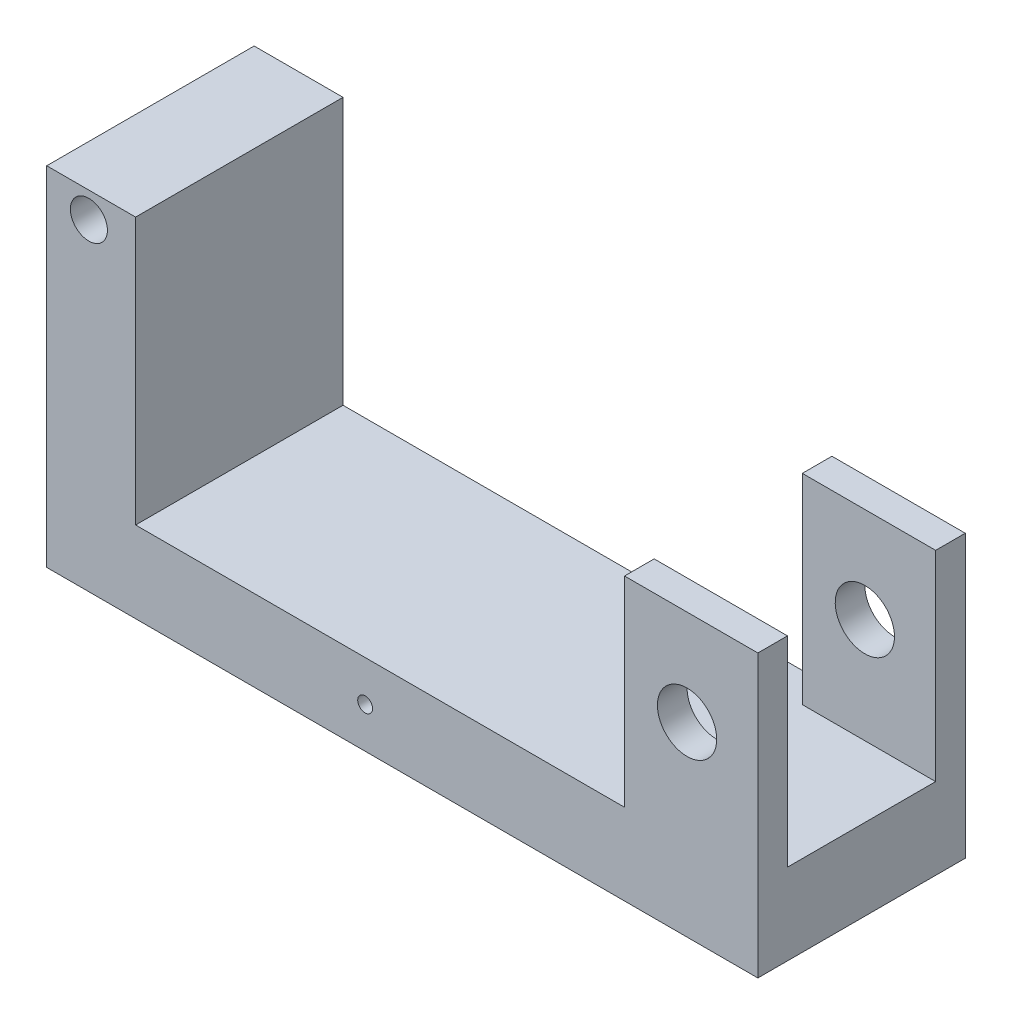
ISO-10303-21;
HEADER;
FILE_DESCRIPTION(('STEP AP214'),'2;1');
FILE_NAME('part.step','',(''),(''),'','','');
FILE_SCHEMA(('AUTOMOTIVE_DESIGN { 1 0 10303 214 1 1 1 1 }'));
ENDSEC;
DATA;
#1=APPLICATION_CONTEXT('core data for automotive mechanical design processes');
#2=APPLICATION_PROTOCOL_DEFINITION('international standard','automotive_design',2000,#1);
#3=PRODUCT_CONTEXT('',#1,'mechanical');
#4=PRODUCT('Part','Part','',(#3));
#5=PRODUCT_RELATED_PRODUCT_CATEGORY('part','',(#4));
#6=PRODUCT_DEFINITION_FORMATION('','',#4);
#7=PRODUCT_DEFINITION_CONTEXT('part definition',#1,'design');
#8=PRODUCT_DEFINITION('design','',#6,#7);
#9=PRODUCT_DEFINITION_SHAPE('','',#8);
#10=(LENGTH_UNIT() NAMED_UNIT(*) SI_UNIT(.MILLI.,.METRE.));
#11=(NAMED_UNIT(*) PLANE_ANGLE_UNIT() SI_UNIT($,.RADIAN.));
#12=(NAMED_UNIT(*) SI_UNIT($,.STERADIAN.) SOLID_ANGLE_UNIT());
#13=UNCERTAINTY_MEASURE_WITH_UNIT(LENGTH_MEASURE(1.E-05),#10,'distance_accuracy_value','');
#14=(GEOMETRIC_REPRESENTATION_CONTEXT(3) GLOBAL_UNCERTAINTY_ASSIGNED_CONTEXT((#13)) GLOBAL_UNIT_ASSIGNED_CONTEXT((#10,
#11,#12)) REPRESENTATION_CONTEXT('',''));
#15=CARTESIAN_POINT('',(0.,0.,0.));
#16=DIRECTION('',(0.,0.,1.));
#17=DIRECTION('',(1.,0.,0.));
#18=AXIS2_PLACEMENT_3D('',#15,#16,#17);
#19=CARTESIAN_POINT('',(190.5,241.3,177.8));
#20=DIRECTION('',(0.,-1.,0.));
#21=DIRECTION('',(1.,0.,0.));
#22=AXIS2_PLACEMENT_3D('',#19,#20,#21);
#23=PLANE('',#22);
#24=DIRECTION('',(0.,0.,-1.));
#25=VECTOR('',#24,1.);
#26=CARTESIAN_POINT('',(190.5,241.3,177.8));
#27=LINE('',#26,#25);
#28=CARTESIAN_POINT('',(190.5,241.3,25.3999999999999));
#29=VERTEX_POINT('',#28);
#30=CARTESIAN_POINT('',(190.5,241.3,0.));
#31=VERTEX_POINT('',#30);
#32=EDGE_CURVE('E193',#29,#31,#27,.T.);
#33=ORIENTED_EDGE('',*,*,#32,.F.);
#34=DIRECTION('',(-1.,0.,0.));
#35=VECTOR('',#34,1.);
#36=CARTESIAN_POINT('',(304.8,241.3,25.3999999999999));
#37=LINE('',#36,#35);
#38=CARTESIAN_POINT('',(304.8,241.3,25.3999999999999));
#39=VERTEX_POINT('',#38);
#40=EDGE_CURVE('E208',#39,#29,#37,.T.);
#41=ORIENTED_EDGE('',*,*,#40,.F.);
#42=DIRECTION('',(0.,0.,-1.));
#43=VECTOR('',#42,1.);
#44=CARTESIAN_POINT('',(304.8,241.3,177.8));
#45=LINE('',#44,#43);
#46=CARTESIAN_POINT('',(304.8,241.3,0.));
#47=VERTEX_POINT('',#46);
#48=EDGE_CURVE('E198',#39,#47,#45,.T.);
#49=ORIENTED_EDGE('',*,*,#48,.T.);
#50=DIRECTION('',(-1.,0.,0.));
#51=VECTOR('',#50,1.);
#52=CARTESIAN_POINT('',(190.5,241.3,0.));
#53=LINE('',#52,#51);
#54=EDGE_CURVE('E170',#47,#31,#53,.T.);
#55=ORIENTED_EDGE('',*,*,#54,.T.);
#56=EDGE_LOOP('',(#33,#41,#49,#55));
#57=FACE_BOUND('',#56,.T.);
#58=ADVANCED_FACE('F42',(#57),#23,.F.);
#59=CARTESIAN_POINT('',(190.5,69.5966190196249,177.8));
#60=DIRECTION('',(1.,0.,0.));
#61=DIRECTION('',(0.,0.,-1.));
#62=AXIS2_PLACEMENT_3D('',#59,#60,#61);
#63=PLANE('',#62);
#64=DIRECTION('',(0.,0.,-1.));
#65=VECTOR('',#64,1.);
#66=CARTESIAN_POINT('',(190.5,69.5966190196249,177.8));
#67=LINE('',#66,#65);
#68=CARTESIAN_POINT('',(190.5,69.5966190196249,25.3999999999999));
#69=VERTEX_POINT('',#68);
#70=CARTESIAN_POINT('',(190.5,69.5966190196249,0.));
#71=VERTEX_POINT('',#70);
#72=EDGE_CURVE('E147',#69,#71,#67,.T.);
#73=ORIENTED_EDGE('',*,*,#72,.F.);
#74=DIRECTION('',(0.,-1.,0.));
#75=VECTOR('',#74,1.);
#76=CARTESIAN_POINT('',(190.5,69.5966190196248,25.4));
#77=LINE('',#76,#75);
#78=EDGE_CURVE('E60',#29,#69,#77,.T.);
#79=ORIENTED_EDGE('',*,*,#78,.F.);
#80=ORIENTED_EDGE('',*,*,#32,.T.);
#81=DIRECTION('',(0.,-1.,0.));
#82=VECTOR('',#81,1.);
#83=CARTESIAN_POINT('',(190.5,69.5966190196249,0.));
#84=LINE('',#83,#82);
#85=EDGE_CURVE('E174',#31,#71,#84,.T.);
#86=ORIENTED_EDGE('',*,*,#85,.T.);
#87=EDGE_LOOP('',(#73,#79,#80,#86));
#88=FACE_BOUND('',#87,.T.);
#89=ADVANCED_FACE('F320',(#88),#63,.F.);
#90=CARTESIAN_POINT('',(244.103977455658,159.533856410939,0.));
#91=DIRECTION('',(0.,0.,1.));
#92=DIRECTION('',(1.,0.,0.));
#93=AXIS2_PLACEMENT_3D('',#90,#91,#92);
#94=CYLINDRICAL_SURFACE('',#93,25.4);
#95=CARTESIAN_POINT('',(244.103977455658,159.533856410939,25.4));
#96=DIRECTION('',(0.,0.,-1.));
#97=DIRECTION('',(0.,1.,0.));
#98=AXIS2_PLACEMENT_3D('',#95,#96,#97);
#99=CIRCLE('',#98,25.4);
#100=CARTESIAN_POINT('',(244.103977455658,184.933856410939,25.4));
#101=VERTEX_POINT('',#100);
#102=EDGE_CURVE('E46',#101,#101,#99,.F.);
#103=ORIENTED_EDGE('',*,*,#102,.T.);
#104=EDGE_LOOP('',(#103));
#105=FACE_BOUND('',#104,.T.);
#106=CARTESIAN_POINT('',(244.103977455658,159.533856410939,0.));
#107=DIRECTION('',(0.,0.,1.));
#108=DIRECTION('',(1.,0.,0.));
#109=AXIS2_PLACEMENT_3D('',#106,#107,#108);
#110=CIRCLE('',#109,25.4);
#111=CARTESIAN_POINT('',(269.503977455658,159.533856410939,0.));
#112=VERTEX_POINT('',#111);
#113=EDGE_CURVE('E163',#112,#112,#110,.T.);
#114=ORIENTED_EDGE('',*,*,#113,.F.);
#115=EDGE_LOOP('',(#114));
#116=FACE_BOUND('',#115,.T.);
#117=ADVANCED_FACE('F326',(#105,#116),#94,.F.);
#118=CARTESIAN_POINT('',(-304.8,0.,177.8));
#119=DIRECTION('',(1.,0.,0.));
#120=DIRECTION('',(0.,0.,-1.));
#121=AXIS2_PLACEMENT_3D('',#118,#119,#120);
#122=PLANE('',#121);
#123=DIRECTION('',(0.,-1.,0.));
#124=VECTOR('',#123,1.);
#125=CARTESIAN_POINT('',(-304.8,0.,0.));
#126=LINE('',#125,#124);
#127=CARTESIAN_POINT('',(-304.8,298.196619019625,0.));
#128=VERTEX_POINT('',#127);
#129=CARTESIAN_POINT('',(-304.8,0.,0.));
#130=VERTEX_POINT('',#129);
#131=EDGE_CURVE('E158',#128,#130,#126,.T.);
#132=ORIENTED_EDGE('',*,*,#131,.T.);
#133=DIRECTION('',(0.,0.,-1.));
#134=VECTOR('',#133,1.);
#135=CARTESIAN_POINT('',(-304.8,0.,177.8));
#136=LINE('',#135,#134);
#137=CARTESIAN_POINT('',(-304.8,0.,177.8));
#138=VERTEX_POINT('',#137);
#139=EDGE_CURVE('E11',#138,#130,#136,.T.);
#140=ORIENTED_EDGE('',*,*,#139,.F.);
#141=DIRECTION('',(0.,-1.,0.));
#142=VECTOR('',#141,1.);
#143=CARTESIAN_POINT('',(-304.8,0.,177.8));
#144=LINE('',#143,#142);
#145=CARTESIAN_POINT('',(-304.8,298.196619019625,177.8));
#146=VERTEX_POINT('',#145);
#147=EDGE_CURVE('E185',#146,#138,#144,.T.);
#148=ORIENTED_EDGE('',*,*,#147,.F.);
#149=DIRECTION('',(0.,0.,-1.));
#150=VECTOR('',#149,1.);
#151=CARTESIAN_POINT('',(-304.8,298.196619019625,177.8));
#152=LINE('',#151,#150);
#153=EDGE_CURVE('E154',#146,#128,#152,.T.);
#154=ORIENTED_EDGE('',*,*,#153,.T.);
#155=EDGE_LOOP('',(#132,#140,#148,#154));
#156=FACE_BOUND('',#155,.T.);
#157=ADVANCED_FACE('F44',(#156),#122,.F.);
#158=CARTESIAN_POINT('',(-304.8,0.,177.8));
#159=DIRECTION('',(0.,1.,0.));
#160=DIRECTION('',(-1.,0.,0.));
#161=AXIS2_PLACEMENT_3D('',#158,#159,#160);
#162=PLANE('',#161);
#163=DIRECTION('',(1.,0.,0.));
#164=VECTOR('',#163,1.);
#165=CARTESIAN_POINT('',(-304.8,0.,0.));
#166=LINE('',#165,#164);
#167=CARTESIAN_POINT('',(304.8,0.,0.));
#168=VERTEX_POINT('',#167);
#169=EDGE_CURVE('E162',#130,#168,#166,.T.);
#170=ORIENTED_EDGE('',*,*,#169,.T.);
#171=DIRECTION('',(0.,0.,-1.));
#172=VECTOR('',#171,1.);
#173=CARTESIAN_POINT('',(304.8,0.,177.8));
#174=LINE('',#173,#172);
#175=CARTESIAN_POINT('',(304.8,0.,177.8));
#176=VERTEX_POINT('',#175);
#177=EDGE_CURVE('E52',#176,#168,#174,.T.);
#178=ORIENTED_EDGE('',*,*,#177,.F.);
#179=DIRECTION('',(1.,0.,0.));
#180=VECTOR('',#179,1.);
#181=CARTESIAN_POINT('',(-304.8,0.,177.8));
#182=LINE('',#181,#180);
#183=EDGE_CURVE('E110',#138,#176,#182,.T.);
#184=ORIENTED_EDGE('',*,*,#183,.F.);
#185=ORIENTED_EDGE('',*,*,#139,.T.);
#186=EDGE_LOOP('',(#170,#178,#184,#185));
#187=FACE_BOUND('',#186,.T.);
#188=ADVANCED_FACE('F336',(#187),#162,.F.);
#189=CARTESIAN_POINT('',(304.8,241.3,177.8));
#190=DIRECTION('',(-1.,0.,0.));
#191=DIRECTION('',(0.,0.,1.));
#192=AXIS2_PLACEMENT_3D('',#189,#190,#191);
#193=PLANE('',#192);
#194=ORIENTED_EDGE('',*,*,#48,.F.);
#195=DIRECTION('',(0.,-1.,0.));
#196=VECTOR('',#195,1.);
#197=CARTESIAN_POINT('',(304.8,69.5966190196248,25.4));
#198=LINE('',#197,#196);
#199=CARTESIAN_POINT('',(304.8,69.5966190196248,25.4));
#200=VERTEX_POINT('',#199);
#201=EDGE_CURVE('E294',#39,#200,#198,.T.);
#202=ORIENTED_EDGE('',*,*,#201,.T.);
#203=DIRECTION('',(0.,0.,1.));
#204=VECTOR('',#203,1.);
#205=CARTESIAN_POINT('',(304.8,69.5966190196248,25.4));
#206=LINE('',#205,#204);
#207=CARTESIAN_POINT('',(304.8,69.5966190196248,152.4));
#208=VERTEX_POINT('',#207);
#209=EDGE_CURVE('E297',#200,#208,#206,.T.);
#210=ORIENTED_EDGE('',*,*,#209,.T.);
#211=DIRECTION('',(0.,1.,0.));
#212=VECTOR('',#211,1.);
#213=CARTESIAN_POINT('',(304.8,69.5966190196248,152.4));
#214=LINE('',#213,#212);
#215=CARTESIAN_POINT('',(304.8,241.3,152.4));
#216=VERTEX_POINT('',#215);
#217=EDGE_CURVE('E233',#208,#216,#214,.T.);
#218=ORIENTED_EDGE('',*,*,#217,.T.);
#219=CARTESIAN_POINT('',(304.8,241.3,177.8));
#220=VERTEX_POINT('',#219);
#221=EDGE_CURVE('E199',#220,#216,#45,.T.);
#222=ORIENTED_EDGE('',*,*,#221,.F.);
#223=DIRECTION('',(0.,1.,0.));
#224=VECTOR('',#223,1.);
#225=CARTESIAN_POINT('',(304.8,241.3,177.8));
#226=LINE('',#225,#224);
#227=EDGE_CURVE('E260',#176,#220,#226,.T.);
#228=ORIENTED_EDGE('',*,*,#227,.F.);
#229=ORIENTED_EDGE('',*,*,#177,.T.);
#230=DIRECTION('',(0.,1.,0.));
#231=VECTOR('',#230,1.);
#232=CARTESIAN_POINT('',(304.8,241.3,0.));
#233=LINE('',#232,#231);
#234=EDGE_CURVE('E166',#168,#47,#233,.T.);
#235=ORIENTED_EDGE('',*,*,#234,.T.);
#236=EDGE_LOOP('',(#194,#202,#210,#218,#222,#228,#229,#235));
#237=FACE_BOUND('',#236,.T.);
#238=ADVANCED_FACE('F303',(#237),#193,.F.);
#239=ORIENTED_EDGE('',*,*,#221,.T.);
#240=DIRECTION('',(-1.,0.,0.));
#241=VECTOR('',#240,1.);
#242=CARTESIAN_POINT('',(304.8,241.3,152.4));
#243=LINE('',#242,#241);
#244=CARTESIAN_POINT('',(190.5,241.3,152.4));
#245=VERTEX_POINT('',#244);
#246=EDGE_CURVE('E215',#216,#245,#243,.T.);
#247=ORIENTED_EDGE('',*,*,#246,.T.);
#248=CARTESIAN_POINT('',(190.5,241.3,177.8));
#249=VERTEX_POINT('',#248);
#250=EDGE_CURVE('E194',#249,#245,#27,.T.);
#251=ORIENTED_EDGE('',*,*,#250,.F.);
#252=DIRECTION('',(-1.,0.,0.));
#253=VECTOR('',#252,1.);
#254=CARTESIAN_POINT('',(190.5,241.3,177.8));
#255=LINE('',#254,#253);
#256=EDGE_CURVE('E263',#220,#249,#255,.T.);
#257=ORIENTED_EDGE('',*,*,#256,.F.);
#258=EDGE_LOOP('',(#239,#247,#251,#257));
#259=FACE_BOUND('',#258,.T.);
#260=ADVANCED_FACE('F271',(#259),#23,.F.);
#261=ORIENTED_EDGE('',*,*,#250,.T.);
#262=DIRECTION('',(0.,1.,0.));
#263=VECTOR('',#262,1.);
#264=CARTESIAN_POINT('',(190.5,69.5966190196248,152.4));
#265=LINE('',#264,#263);
#266=CARTESIAN_POINT('',(190.5,69.5966190196248,152.4));
#267=VERTEX_POINT('',#266);
#268=EDGE_CURVE('E224',#267,#245,#265,.T.);
#269=ORIENTED_EDGE('',*,*,#268,.F.);
#270=CARTESIAN_POINT('',(190.5,69.5966190196249,177.8));
#271=VERTEX_POINT('',#270);
#272=EDGE_CURVE('E190',#271,#267,#67,.T.);
#273=ORIENTED_EDGE('',*,*,#272,.F.);
#274=DIRECTION('',(0.,-1.,0.));
#275=VECTOR('',#274,1.);
#276=CARTESIAN_POINT('',(190.5,69.5966190196249,177.8));
#277=LINE('',#276,#275);
#278=EDGE_CURVE('E133',#249,#271,#277,.T.);
#279=ORIENTED_EDGE('',*,*,#278,.F.);
#280=EDGE_LOOP('',(#261,#269,#273,#279));
#281=FACE_BOUND('',#280,.T.);
#282=ADVANCED_FACE('F276',(#281),#63,.F.);
#283=CARTESIAN_POINT('',(-228.6,69.5966190196249,177.8));
#284=DIRECTION('',(0.,-1.,0.));
#285=DIRECTION('',(0.,0.,-1.));
#286=AXIS2_PLACEMENT_3D('',#283,#284,#285);
#287=PLANE('',#286);
#288=DIRECTION('',(-1.,0.,0.));
#289=VECTOR('',#288,1.);
#290=CARTESIAN_POINT('',(-228.6,69.5966190196249,0.));
#291=LINE('',#290,#289);
#292=CARTESIAN_POINT('',(-228.6,69.5966190196249,0.));
#293=VERTEX_POINT('',#292);
#294=EDGE_CURVE('E143',#71,#293,#291,.T.);
#295=ORIENTED_EDGE('',*,*,#294,.T.);
#296=DIRECTION('',(0.,0.,-1.));
#297=VECTOR('',#296,1.);
#298=CARTESIAN_POINT('',(-228.6,69.5966190196249,177.8));
#299=LINE('',#298,#297);
#300=CARTESIAN_POINT('',(-228.6,69.5966190196249,177.8));
#301=VERTEX_POINT('',#300);
#302=EDGE_CURVE('E140',#301,#293,#299,.T.);
#303=ORIENTED_EDGE('',*,*,#302,.F.);
#304=DIRECTION('',(-1.,0.,0.));
#305=VECTOR('',#304,1.);
#306=CARTESIAN_POINT('',(-228.6,69.5966190196249,177.8));
#307=LINE('',#306,#305);
#308=EDGE_CURVE('E126',#271,#301,#307,.T.);
#309=ORIENTED_EDGE('',*,*,#308,.F.);
#310=ORIENTED_EDGE('',*,*,#272,.T.);
#311=DIRECTION('',(-1.,0.,0.));
#312=VECTOR('',#311,1.);
#313=CARTESIAN_POINT('',(304.8,69.5966190196248,152.4));
#314=LINE('',#313,#312);
#315=EDGE_CURVE('E221',#208,#267,#314,.T.);
#316=ORIENTED_EDGE('',*,*,#315,.F.);
#317=ORIENTED_EDGE('',*,*,#209,.F.);
#318=DIRECTION('',(-1.,0.,0.));
#319=VECTOR('',#318,1.);
#320=CARTESIAN_POINT('',(304.8,69.5966190196248,25.4));
#321=LINE('',#320,#319);
#322=EDGE_CURVE('E230',#200,#69,#321,.T.);
#323=ORIENTED_EDGE('',*,*,#322,.T.);
#324=ORIENTED_EDGE('',*,*,#72,.T.);
#325=EDGE_LOOP('',(#295,#303,#309,#310,#316,#317,#323,#324));
#326=FACE_BOUND('',#325,.T.);
#327=ADVANCED_FACE('F141',(#326),#287,.F.);
#328=CARTESIAN_POINT('',(-228.6,298.196619019625,177.8));
#329=DIRECTION('',(-1.,0.,0.));
#330=DIRECTION('',(0.,-1.,0.));
#331=AXIS2_PLACEMENT_3D('',#328,#329,#330);
#332=PLANE('',#331);
#333=DIRECTION('',(0.,1.,0.));
#334=VECTOR('',#333,1.);
#335=CARTESIAN_POINT('',(-228.6,298.196619019625,0.));
#336=LINE('',#335,#334);
#337=CARTESIAN_POINT('',(-228.6,298.196619019625,0.));
#338=VERTEX_POINT('',#337);
#339=EDGE_CURVE('E180',#293,#338,#336,.T.);
#340=ORIENTED_EDGE('',*,*,#339,.T.);
#341=DIRECTION('',(0.,0.,-1.));
#342=VECTOR('',#341,1.);
#343=CARTESIAN_POINT('',(-228.6,298.196619019625,177.8));
#344=LINE('',#343,#342);
#345=CARTESIAN_POINT('',(-228.6,298.196619019625,177.8));
#346=VERTEX_POINT('',#345);
#347=EDGE_CURVE('E148',#346,#338,#344,.T.);
#348=ORIENTED_EDGE('',*,*,#347,.F.);
#349=DIRECTION('',(0.,1.,0.));
#350=VECTOR('',#349,1.);
#351=CARTESIAN_POINT('',(-228.6,298.196619019625,177.8));
#352=LINE('',#351,#350);
#353=EDGE_CURVE('E130',#301,#346,#352,.T.);
#354=ORIENTED_EDGE('',*,*,#353,.F.);
#355=ORIENTED_EDGE('',*,*,#302,.T.);
#356=EDGE_LOOP('',(#340,#348,#354,#355));
#357=FACE_BOUND('',#356,.T.);
#358=ADVANCED_FACE('F150',(#357),#332,.F.);
#359=CARTESIAN_POINT('',(-304.8,298.196619019625,177.8));
#360=DIRECTION('',(0.,-1.,0.));
#361=DIRECTION('',(0.,0.,-1.));
#362=AXIS2_PLACEMENT_3D('',#359,#360,#361);
#363=PLANE('',#362);
#364=DIRECTION('',(-1.,0.,0.));
#365=VECTOR('',#364,1.);
#366=CARTESIAN_POINT('',(-304.8,298.196619019625,0.));
#367=LINE('',#366,#365);
#368=EDGE_CURVE('E102',#338,#128,#367,.T.);
#369=ORIENTED_EDGE('',*,*,#368,.T.);
#370=ORIENTED_EDGE('',*,*,#153,.F.);
#371=DIRECTION('',(-1.,0.,0.));
#372=VECTOR('',#371,1.);
#373=CARTESIAN_POINT('',(-304.8,298.196619019625,177.8));
#374=LINE('',#373,#372);
#375=EDGE_CURVE('E69',#346,#146,#374,.T.);
#376=ORIENTED_EDGE('',*,*,#375,.F.);
#377=ORIENTED_EDGE('',*,*,#347,.T.);
#378=EDGE_LOOP('',(#369,#370,#376,#377));
#379=FACE_BOUND('',#378,.T.);
#380=ADVANCED_FACE('F354',(#379),#363,.F.);
#381=CARTESIAN_POINT('',(0.,0.,177.8));
#382=DIRECTION('',(0.,0.,-1.));
#383=DIRECTION('',(-1.,0.,0.));
#384=AXIS2_PLACEMENT_3D('',#381,#382,#383);
#385=PLANE('',#384);
#386=CARTESIAN_POINT('',(244.103977455658,159.533856410939,177.8));
#387=DIRECTION('',(0.,0.,1.));
#388=DIRECTION('',(1.,0.,0.));
#389=AXIS2_PLACEMENT_3D('',#386,#387,#388);
#390=CIRCLE('',#389,25.4);
#391=CARTESIAN_POINT('',(269.503977455658,159.533856410939,177.8));
#392=VERTEX_POINT('',#391);
#393=EDGE_CURVE('E237',#392,#392,#390,.T.);
#394=ORIENTED_EDGE('',*,*,#393,.F.);
#395=EDGE_LOOP('',(#394));
#396=FACE_BOUND('',#395,.T.);
#397=CARTESIAN_POINT('',(-268.66321337454,276.196433082481,177.8));
#398=DIRECTION('',(0.,0.,1.));
#399=DIRECTION('',(1.,0.,0.));
#400=AXIS2_PLACEMENT_3D('',#397,#398,#399);
#401=CIRCLE('',#400,15.875);
#402=CARTESIAN_POINT('',(-252.78821337454,276.196433082481,177.8));
#403=VERTEX_POINT('',#402);
#404=EDGE_CURVE('E241',#403,#403,#401,.T.);
#405=ORIENTED_EDGE('',*,*,#404,.F.);
#406=EDGE_LOOP('',(#405));
#407=FACE_BOUND('',#406,.T.);
#408=CARTESIAN_POINT('',(-31.8673873746655,34.7983095098124,177.8));
#409=DIRECTION('',(0.,0.,1.));
#410=DIRECTION('',(1.,0.,0.));
#411=AXIS2_PLACEMENT_3D('',#408,#409,#410);
#412=CIRCLE('',#411,6.35);
#413=CARTESIAN_POINT('',(-25.5173873746655,34.7983095098124,177.8));
#414=VERTEX_POINT('',#413);
#415=EDGE_CURVE('E249',#414,#414,#412,.T.);
#416=ORIENTED_EDGE('',*,*,#415,.F.);
#417=EDGE_LOOP('',(#416));
#418=FACE_BOUND('',#417,.T.);
#419=ORIENTED_EDGE('',*,*,#147,.T.);
#420=ORIENTED_EDGE('',*,*,#183,.T.);
#421=ORIENTED_EDGE('',*,*,#227,.T.);
#422=ORIENTED_EDGE('',*,*,#256,.T.);
#423=ORIENTED_EDGE('',*,*,#278,.T.);
#424=ORIENTED_EDGE('',*,*,#308,.T.);
#425=ORIENTED_EDGE('',*,*,#353,.T.);
#426=ORIENTED_EDGE('',*,*,#375,.T.);
#427=EDGE_LOOP('',(#419,#420,#421,#422,#423,#424,#425,#426));
#428=FACE_BOUND('',#427,.T.);
#429=ADVANCED_FACE('F128',(#396,#407,#418,#428),#385,.F.);
#430=CARTESIAN_POINT('',(0.,0.,0.));
#431=DIRECTION('',(0.,0.,-1.));
#432=DIRECTION('',(-1.,0.,0.));
#433=AXIS2_PLACEMENT_3D('',#430,#431,#432);
#434=PLANE('',#433);
#435=ORIENTED_EDGE('',*,*,#113,.T.);
#436=EDGE_LOOP('',(#435));
#437=FACE_BOUND('',#436,.T.);
#438=CARTESIAN_POINT('',(-268.66321337454,276.196433082481,0.));
#439=DIRECTION('',(0.,0.,1.));
#440=DIRECTION('',(1.,0.,0.));
#441=AXIS2_PLACEMENT_3D('',#438,#439,#440);
#442=CIRCLE('',#441,15.875);
#443=CARTESIAN_POINT('',(-252.78821337454,276.196433082481,0.));
#444=VERTEX_POINT('',#443);
#445=EDGE_CURVE('E245',#444,#444,#442,.T.);
#446=ORIENTED_EDGE('',*,*,#445,.T.);
#447=EDGE_LOOP('',(#446));
#448=FACE_BOUND('',#447,.T.);
#449=CARTESIAN_POINT('',(-31.8673873746655,34.7983095098124,0.));
#450=DIRECTION('',(0.,0.,1.));
#451=DIRECTION('',(1.,0.,0.));
#452=AXIS2_PLACEMENT_3D('',#449,#450,#451);
#453=CIRCLE('',#452,6.35);
#454=CARTESIAN_POINT('',(-25.5173873746655,34.7983095098124,0.));
#455=VERTEX_POINT('',#454);
#456=EDGE_CURVE('E214',#455,#455,#453,.T.);
#457=ORIENTED_EDGE('',*,*,#456,.T.);
#458=EDGE_LOOP('',(#457));
#459=FACE_BOUND('',#458,.T.);
#460=ORIENTED_EDGE('',*,*,#131,.F.);
#461=ORIENTED_EDGE('',*,*,#368,.F.);
#462=ORIENTED_EDGE('',*,*,#339,.F.);
#463=ORIENTED_EDGE('',*,*,#294,.F.);
#464=ORIENTED_EDGE('',*,*,#85,.F.);
#465=ORIENTED_EDGE('',*,*,#54,.F.);
#466=ORIENTED_EDGE('',*,*,#234,.F.);
#467=ORIENTED_EDGE('',*,*,#169,.F.);
#468=EDGE_LOOP('',(#460,#461,#462,#463,#464,#465,#466,#467));
#469=FACE_BOUND('',#468,.T.);
#470=ADVANCED_FACE('F349',(#437,#448,#459,#469),#434,.T.);
#471=CARTESIAN_POINT('',(-31.8673873746655,34.7983095098124,0.));
#472=DIRECTION('',(0.,0.,1.));
#473=DIRECTION('',(1.,0.,0.));
#474=AXIS2_PLACEMENT_3D('',#471,#472,#473);
#475=CYLINDRICAL_SURFACE('',#474,6.35);
#476=ORIENTED_EDGE('',*,*,#456,.F.);
#477=EDGE_LOOP('',(#476));
#478=FACE_BOUND('',#477,.T.);
#479=ORIENTED_EDGE('',*,*,#415,.T.);
#480=EDGE_LOOP('',(#479));
#481=FACE_BOUND('',#480,.T.);
#482=ADVANCED_FACE('F403',(#478,#481),#475,.F.);
#483=CARTESIAN_POINT('',(-268.66321337454,276.196433082481,0.));
#484=DIRECTION('',(0.,0.,1.));
#485=DIRECTION('',(1.,0.,0.));
#486=AXIS2_PLACEMENT_3D('',#483,#484,#485);
#487=CYLINDRICAL_SURFACE('',#486,15.875);
#488=ORIENTED_EDGE('',*,*,#445,.F.);
#489=EDGE_LOOP('',(#488));
#490=FACE_BOUND('',#489,.T.);
#491=ORIENTED_EDGE('',*,*,#404,.T.);
#492=EDGE_LOOP('',(#491));
#493=FACE_BOUND('',#492,.T.);
#494=ADVANCED_FACE('F413',(#490,#493),#487,.F.);
#495=CARTESIAN_POINT('',(244.103977455658,159.533856410939,152.4));
#496=DIRECTION('',(0.,0.,1.));
#497=DIRECTION('',(1.,0.,0.));
#498=AXIS2_PLACEMENT_3D('',#495,#496,#497);
#499=CIRCLE('',#498,25.4);
#500=CARTESIAN_POINT('',(269.503977455658,159.533856410939,152.4));
#501=VERTEX_POINT('',#500);
#502=EDGE_CURVE('E205',#501,#501,#499,.F.);
#503=ORIENTED_EDGE('',*,*,#502,.T.);
#504=EDGE_LOOP('',(#503));
#505=FACE_BOUND('',#504,.T.);
#506=ORIENTED_EDGE('',*,*,#393,.T.);
#507=EDGE_LOOP('',(#506));
#508=FACE_BOUND('',#507,.T.);
#509=ADVANCED_FACE('F317',(#505,#508),#94,.F.);
#510=CARTESIAN_POINT('',(304.8,69.5966190196248,25.4));
#511=DIRECTION('',(0.,0.,-1.));
#512=DIRECTION('',(0.,1.,0.));
#513=AXIS2_PLACEMENT_3D('',#510,#511,#512);
#514=PLANE('',#513);
#515=ORIENTED_EDGE('',*,*,#78,.T.);
#516=ORIENTED_EDGE('',*,*,#322,.F.);
#517=ORIENTED_EDGE('',*,*,#201,.F.);
#518=ORIENTED_EDGE('',*,*,#40,.T.);
#519=EDGE_LOOP('',(#515,#516,#517,#518));
#520=FACE_BOUND('',#519,.T.);
#521=ORIENTED_EDGE('',*,*,#102,.F.);
#522=EDGE_LOOP('',(#521));
#523=FACE_BOUND('',#522,.T.);
#524=ADVANCED_FACE('F291',(#520,#523),#514,.F.);
#525=CARTESIAN_POINT('',(304.8,69.5966190196248,152.4));
#526=DIRECTION('',(0.,0.,1.));
#527=DIRECTION('',(1.,0.,0.));
#528=AXIS2_PLACEMENT_3D('',#525,#526,#527);
#529=PLANE('',#528);
#530=ORIENTED_EDGE('',*,*,#268,.T.);
#531=ORIENTED_EDGE('',*,*,#246,.F.);
#532=ORIENTED_EDGE('',*,*,#217,.F.);
#533=ORIENTED_EDGE('',*,*,#315,.T.);
#534=EDGE_LOOP('',(#530,#531,#532,#533));
#535=FACE_BOUND('',#534,.T.);
#536=ORIENTED_EDGE('',*,*,#502,.F.);
#537=EDGE_LOOP('',(#536));
#538=FACE_BOUND('',#537,.T.);
#539=ADVANCED_FACE('F310',(#535,#538),#529,.F.);
#540=CLOSED_SHELL('',(#58,#89,#117,#157,#188,#238,#260,#282,#327,#358,#380,#429,#470,#482,#494,
#509,#524,#539));
#541=MANIFOLD_SOLID_BREP('B2',#540);
#542=ADVANCED_BREP_SHAPE_REPRESENTATION('',(#18,#541),#14);
#543=SHAPE_DEFINITION_REPRESENTATION(#9,#542);
ENDSEC;
END-ISO-10303-21;
